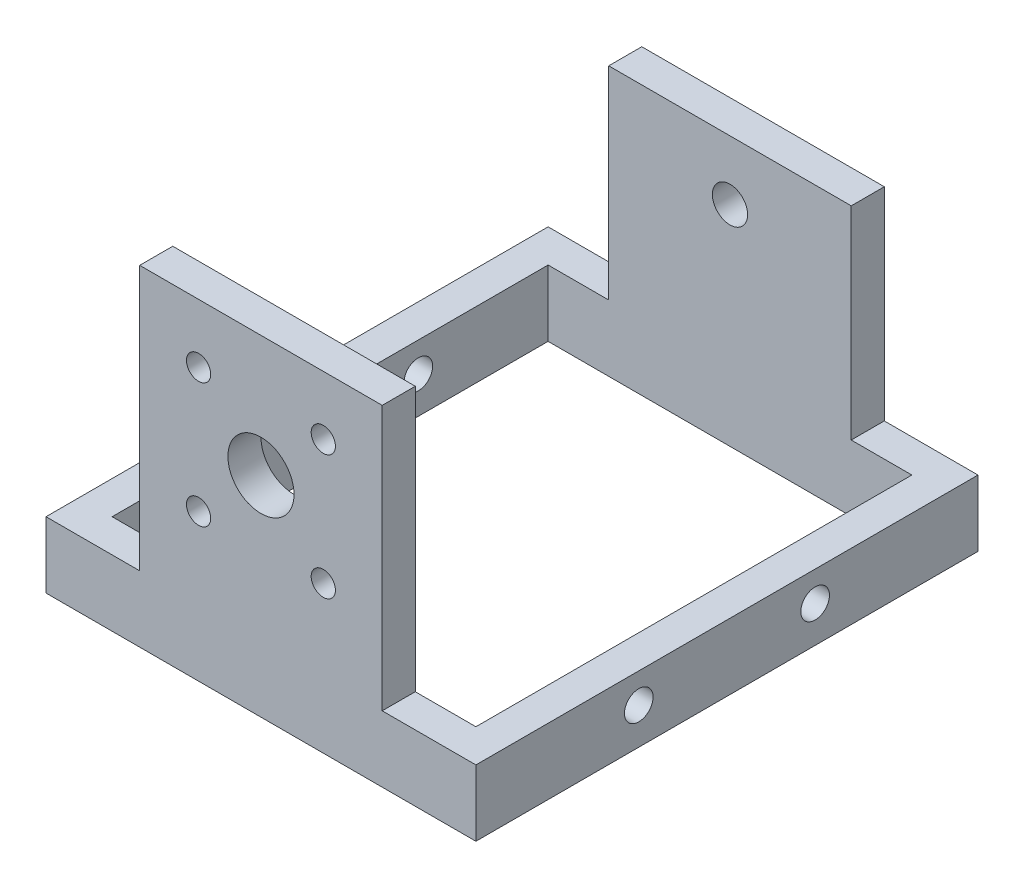
ISO-10303-21;
HEADER;
FILE_DESCRIPTION(('STEP AP214'),'2;1');
FILE_NAME('part.step','',(''),(''),'','','');
FILE_SCHEMA(('AUTOMOTIVE_DESIGN { 1 0 10303 214 1 1 1 1 }'));
ENDSEC;
DATA;
#1=APPLICATION_CONTEXT('core data for automotive mechanical design processes');
#2=APPLICATION_PROTOCOL_DEFINITION('international standard','automotive_design',2000,#1);
#3=PRODUCT_CONTEXT('',#1,'mechanical');
#4=PRODUCT('Part','Part','',(#3));
#5=PRODUCT_RELATED_PRODUCT_CATEGORY('part','',(#4));
#6=PRODUCT_DEFINITION_FORMATION('','',#4);
#7=PRODUCT_DEFINITION_CONTEXT('part definition',#1,'design');
#8=PRODUCT_DEFINITION('design','',#6,#7);
#9=PRODUCT_DEFINITION_SHAPE('','',#8);
#10=(LENGTH_UNIT() NAMED_UNIT(*) SI_UNIT(.MILLI.,.METRE.));
#11=(NAMED_UNIT(*) PLANE_ANGLE_UNIT() SI_UNIT($,.RADIAN.));
#12=(NAMED_UNIT(*) SI_UNIT($,.STERADIAN.) SOLID_ANGLE_UNIT());
#13=UNCERTAINTY_MEASURE_WITH_UNIT(LENGTH_MEASURE(1.E-05),#10,'distance_accuracy_value','');
#14=(GEOMETRIC_REPRESENTATION_CONTEXT(3) GLOBAL_UNCERTAINTY_ASSIGNED_CONTEXT((#13)) GLOBAL_UNIT_ASSIGNED_CONTEXT((#10,
#11,#12)) REPRESENTATION_CONTEXT('',''));
#15=CARTESIAN_POINT('',(0.,0.,0.));
#16=DIRECTION('',(0.,0.,1.));
#17=DIRECTION('',(1.,0.,0.));
#18=AXIS2_PLACEMENT_3D('',#15,#16,#17);
#19=CARTESIAN_POINT('',(0.,6.,-19.775));
#20=DIRECTION('',(0.,0.,1.));
#21=DIRECTION('',(1.,0.,0.));
#22=AXIS2_PLACEMENT_3D('',#19,#20,#21);
#23=PLANE('',#22);
#24=CARTESIAN_POINT('',(0.,19.,-19.775));
#25=DIRECTION('',(0.,0.,1.));
#26=DIRECTION('',(1.,0.,0.));
#27=AXIS2_PLACEMENT_3D('',#24,#25,#26);
#28=CIRCLE('',#27,1.6);
#29=CARTESIAN_POINT('',(1.6,19.,-19.775));
#30=VERTEX_POINT('',#29);
#31=EDGE_CURVE('E295',#30,#30,#28,.F.);
#32=ORIENTED_EDGE('',*,*,#31,.T.);
#33=EDGE_LOOP('',(#32));
#34=FACE_BOUND('',#33,.T.);
#35=DIRECTION('',(-1.,0.,0.));
#36=VECTOR('',#35,1.);
#37=CARTESIAN_POINT('',(0.,0.,-19.775));
#38=LINE('',#37,#36);
#39=CARTESIAN_POINT('',(16.5,0.,-19.775));
#40=VERTEX_POINT('',#39);
#41=CARTESIAN_POINT('',(-16.5,0.,-19.775));
#42=VERTEX_POINT('',#41);
#43=EDGE_CURVE('E237',#40,#42,#38,.T.);
#44=ORIENTED_EDGE('',*,*,#43,.F.);
#45=DIRECTION('',(0.,-1.,0.));
#46=VECTOR('',#45,1.);
#47=CARTESIAN_POINT('',(16.5,6.,-19.775));
#48=LINE('',#47,#46);
#49=CARTESIAN_POINT('',(16.5,6.,-19.775));
#50=VERTEX_POINT('',#49);
#51=EDGE_CURVE('E11',#50,#40,#48,.T.);
#52=ORIENTED_EDGE('',*,*,#51,.F.);
#53=DIRECTION('',(-1.,0.,0.));
#54=VECTOR('',#53,1.);
#55=CARTESIAN_POINT('',(0.,6.,-19.775));
#56=LINE('',#55,#54);
#57=CARTESIAN_POINT('',(11.,6.,-19.775));
#58=VERTEX_POINT('',#57);
#59=EDGE_CURVE('E240',#50,#58,#56,.T.);
#60=ORIENTED_EDGE('',*,*,#59,.T.);
#61=DIRECTION('',(0.,-1.,0.));
#62=VECTOR('',#61,1.);
#63=CARTESIAN_POINT('',(11.,24.4,-19.775));
#64=LINE('',#63,#62);
#65=CARTESIAN_POINT('',(11.,24.4,-19.775));
#66=VERTEX_POINT('',#65);
#67=EDGE_CURVE('E159',#66,#58,#64,.T.);
#68=ORIENTED_EDGE('',*,*,#67,.F.);
#69=DIRECTION('',(-1.,0.,0.));
#70=VECTOR('',#69,1.);
#71=CARTESIAN_POINT('',(0.,24.4,-19.775));
#72=LINE('',#71,#70);
#73=CARTESIAN_POINT('',(-11.,24.4,-19.775));
#74=VERTEX_POINT('',#73);
#75=EDGE_CURVE('E164',#66,#74,#72,.T.);
#76=ORIENTED_EDGE('',*,*,#75,.T.);
#77=DIRECTION('',(0.,-1.,0.));
#78=VECTOR('',#77,1.);
#79=CARTESIAN_POINT('',(-11.,24.4,-19.775));
#80=LINE('',#79,#78);
#81=CARTESIAN_POINT('',(-11.,6.,-19.775));
#82=VERTEX_POINT('',#81);
#83=EDGE_CURVE('E148',#74,#82,#80,.T.);
#84=ORIENTED_EDGE('',*,*,#83,.T.);
#85=DIRECTION('',(-1.,0.,0.));
#86=VECTOR('',#85,1.);
#87=CARTESIAN_POINT('',(0.,6.,-19.775));
#88=LINE('',#87,#86);
#89=CARTESIAN_POINT('',(-16.5,6.,-19.775));
#90=VERTEX_POINT('',#89);
#91=EDGE_CURVE('E185',#82,#90,#88,.T.);
#92=ORIENTED_EDGE('',*,*,#91,.T.);
#93=DIRECTION('',(0.,-1.,0.));
#94=VECTOR('',#93,1.);
#95=CARTESIAN_POINT('',(-16.5,6.,-19.775));
#96=LINE('',#95,#94);
#97=EDGE_CURVE('E202',#90,#42,#96,.T.);
#98=ORIENTED_EDGE('',*,*,#97,.T.);
#99=EDGE_LOOP('',(#44,#52,#60,#68,#76,#84,#92,#98));
#100=FACE_BOUND('',#99,.T.);
#101=ADVANCED_FACE('F34',(#34,#100),#23,.T.);
#102=CARTESIAN_POINT('',(16.5,6.,0.));
#103=DIRECTION('',(1.,0.,0.));
#104=DIRECTION('',(0.,0.,-1.));
#105=AXIS2_PLACEMENT_3D('',#102,#103,#104);
#106=PLANE('',#105);
#107=CARTESIAN_POINT('',(16.5,3.3,-8.));
#108=DIRECTION('',(1.,0.,0.));
#109=DIRECTION('',(0.,0.,-1.));
#110=AXIS2_PLACEMENT_3D('',#107,#108,#109);
#111=CIRCLE('',#110,1.3);
#112=CARTESIAN_POINT('',(16.5,3.3,-9.3));
#113=VERTEX_POINT('',#112);
#114=EDGE_CURVE('E168',#113,#113,#111,.T.);
#115=ORIENTED_EDGE('',*,*,#114,.T.);
#116=EDGE_LOOP('',(#115));
#117=FACE_BOUND('',#116,.T.);
#118=CARTESIAN_POINT('',(16.5,3.3,8.));
#119=DIRECTION('',(1.,0.,0.));
#120=DIRECTION('',(0.,0.,-1.));
#121=AXIS2_PLACEMENT_3D('',#118,#119,#120);
#122=CIRCLE('',#121,1.3);
#123=CARTESIAN_POINT('',(16.5,3.3,6.7));
#124=VERTEX_POINT('',#123);
#125=EDGE_CURVE('E276',#124,#124,#122,.T.);
#126=ORIENTED_EDGE('',*,*,#125,.T.);
#127=EDGE_LOOP('',(#126));
#128=FACE_BOUND('',#127,.T.);
#129=DIRECTION('',(0.,0.,1.));
#130=VECTOR('',#129,1.);
#131=CARTESIAN_POINT('',(16.5,0.,0.));
#132=LINE('',#131,#130);
#133=CARTESIAN_POINT('',(16.5,0.,19.775));
#134=VERTEX_POINT('',#133);
#135=EDGE_CURVE('E260',#40,#134,#132,.T.);
#136=ORIENTED_EDGE('',*,*,#135,.T.);
#137=DIRECTION('',(0.,-1.,0.));
#138=VECTOR('',#137,1.);
#139=CARTESIAN_POINT('',(16.5,6.,19.775));
#140=LINE('',#139,#138);
#141=CARTESIAN_POINT('',(16.5,6.,19.775));
#142=VERTEX_POINT('',#141);
#143=EDGE_CURVE('E42',#142,#134,#140,.T.);
#144=ORIENTED_EDGE('',*,*,#143,.F.);
#145=DIRECTION('',(0.,0.,1.));
#146=VECTOR('',#145,1.);
#147=CARTESIAN_POINT('',(16.5,6.,0.));
#148=LINE('',#147,#146);
#149=EDGE_CURVE('E243',#50,#142,#148,.T.);
#150=ORIENTED_EDGE('',*,*,#149,.F.);
#151=ORIENTED_EDGE('',*,*,#51,.T.);
#152=EDGE_LOOP('',(#136,#144,#150,#151));
#153=FACE_BOUND('',#152,.T.);
#154=ADVANCED_FACE('F328',(#117,#128,#153),#106,.F.);
#155=CARTESIAN_POINT('',(0.,6.,19.775));
#156=DIRECTION('',(0.,0.,1.));
#157=DIRECTION('',(1.,0.,0.));
#158=AXIS2_PLACEMENT_3D('',#155,#156,#157);
#159=PLANE('',#158);
#160=CARTESIAN_POINT('',(5.65685424949244,13.3431457505077,19.775));
#161=DIRECTION('',(0.,0.,1.));
#162=DIRECTION('',(1.,0.,0.));
#163=AXIS2_PLACEMENT_3D('',#160,#161,#162);
#164=CIRCLE('',#163,1.1);
#165=CARTESIAN_POINT('',(6.75685424949244,13.3431457505077,19.775));
#166=VERTEX_POINT('',#165);
#167=EDGE_CURVE('E398',#166,#166,#164,.F.);
#168=ORIENTED_EDGE('',*,*,#167,.F.);
#169=EDGE_LOOP('',(#168));
#170=FACE_BOUND('',#169,.T.);
#171=CARTESIAN_POINT('',(-5.65685424949241,24.6568542494924,19.775));
#172=DIRECTION('',(0.,0.,1.));
#173=DIRECTION('',(1.,0.,0.));
#174=AXIS2_PLACEMENT_3D('',#171,#172,#173);
#175=CIRCLE('',#174,1.1);
#176=CARTESIAN_POINT('',(-4.5568542494924,24.6568542494924,19.775));
#177=VERTEX_POINT('',#176);
#178=EDGE_CURVE('E393',#177,#177,#175,.F.);
#179=ORIENTED_EDGE('',*,*,#178,.F.);
#180=EDGE_LOOP('',(#179));
#181=FACE_BOUND('',#180,.T.);
#182=CARTESIAN_POINT('',(-5.65685424949238,13.3431457505076,19.775));
#183=DIRECTION('',(0.,0.,1.));
#184=DIRECTION('',(1.,0.,0.));
#185=AXIS2_PLACEMENT_3D('',#182,#183,#184);
#186=CIRCLE('',#185,1.1);
#187=CARTESIAN_POINT('',(-4.55685424949238,13.3431457505076,19.775));
#188=VERTEX_POINT('',#187);
#189=EDGE_CURVE('E410',#188,#188,#186,.F.);
#190=ORIENTED_EDGE('',*,*,#189,.F.);
#191=EDGE_LOOP('',(#190));
#192=FACE_BOUND('',#191,.T.);
#193=CARTESIAN_POINT('',(0.,19.,19.775));
#194=DIRECTION('',(0.,0.,1.));
#195=DIRECTION('',(1.,0.,0.));
#196=AXIS2_PLACEMENT_3D('',#193,#194,#195);
#197=CIRCLE('',#196,3.);
#198=CARTESIAN_POINT('',(3.,19.,19.775));
#199=VERTEX_POINT('',#198);
#200=EDGE_CURVE('E383',#199,#199,#197,.F.);
#201=ORIENTED_EDGE('',*,*,#200,.F.);
#202=EDGE_LOOP('',(#201));
#203=FACE_BOUND('',#202,.T.);
#204=CARTESIAN_POINT('',(5.65685424949238,24.6568542494924,19.775));
#205=DIRECTION('',(0.,0.,1.));
#206=DIRECTION('',(1.,0.,0.));
#207=AXIS2_PLACEMENT_3D('',#204,#205,#206);
#208=CIRCLE('',#207,1.1);
#209=CARTESIAN_POINT('',(6.75685424949238,24.6568542494924,19.775));
#210=VERTEX_POINT('',#209);
#211=EDGE_CURVE('E386',#210,#210,#208,.F.);
#212=ORIENTED_EDGE('',*,*,#211,.F.);
#213=EDGE_LOOP('',(#212));
#214=FACE_BOUND('',#213,.T.);
#215=DIRECTION('',(-1.,0.,0.));
#216=VECTOR('',#215,1.);
#217=CARTESIAN_POINT('',(0.,0.,19.775));
#218=LINE('',#217,#216);
#219=CARTESIAN_POINT('',(-16.5,0.,19.775));
#220=VERTEX_POINT('',#219);
#221=EDGE_CURVE('E262',#134,#220,#218,.T.);
#222=ORIENTED_EDGE('',*,*,#221,.T.);
#223=DIRECTION('',(0.,-1.,0.));
#224=VECTOR('',#223,1.);
#225=CARTESIAN_POINT('',(-16.5,6.,19.775));
#226=LINE('',#225,#224);
#227=CARTESIAN_POINT('',(-16.5,6.,19.775));
#228=VERTEX_POINT('',#227);
#229=EDGE_CURVE('E209',#228,#220,#226,.T.);
#230=ORIENTED_EDGE('',*,*,#229,.F.);
#231=DIRECTION('',(-1.,0.,0.));
#232=VECTOR('',#231,1.);
#233=CARTESIAN_POINT('',(0.,6.,19.775));
#234=LINE('',#233,#232);
#235=CARTESIAN_POINT('',(-11.,6.,19.775));
#236=VERTEX_POINT('',#235);
#237=EDGE_CURVE('E197',#236,#228,#234,.T.);
#238=ORIENTED_EDGE('',*,*,#237,.F.);
#239=DIRECTION('',(0.,-1.,0.));
#240=VECTOR('',#239,1.);
#241=CARTESIAN_POINT('',(-11.,30.,19.775));
#242=LINE('',#241,#240);
#243=CARTESIAN_POINT('',(-11.,30.,19.775));
#244=VERTEX_POINT('',#243);
#245=EDGE_CURVE('E50',#244,#236,#242,.T.);
#246=ORIENTED_EDGE('',*,*,#245,.F.);
#247=DIRECTION('',(-1.,0.,0.));
#248=VECTOR('',#247,1.);
#249=CARTESIAN_POINT('',(0.,30.,19.775));
#250=LINE('',#249,#248);
#251=CARTESIAN_POINT('',(11.,30.,19.775));
#252=VERTEX_POINT('',#251);
#253=EDGE_CURVE('E221',#252,#244,#250,.T.);
#254=ORIENTED_EDGE('',*,*,#253,.F.);
#255=DIRECTION('',(0.,-1.,0.));
#256=VECTOR('',#255,1.);
#257=CARTESIAN_POINT('',(11.,30.,19.775));
#258=LINE('',#257,#256);
#259=CARTESIAN_POINT('',(11.,6.,19.775));
#260=VERTEX_POINT('',#259);
#261=EDGE_CURVE('E234',#252,#260,#258,.T.);
#262=ORIENTED_EDGE('',*,*,#261,.T.);
#263=DIRECTION('',(-1.,0.,0.));
#264=VECTOR('',#263,1.);
#265=CARTESIAN_POINT('',(0.,6.,19.775));
#266=LINE('',#265,#264);
#267=EDGE_CURVE('E245',#142,#260,#266,.T.);
#268=ORIENTED_EDGE('',*,*,#267,.F.);
#269=ORIENTED_EDGE('',*,*,#143,.T.);
#270=EDGE_LOOP('',(#222,#230,#238,#246,#254,#262,#268,#269));
#271=FACE_BOUND('',#270,.T.);
#272=ADVANCED_FACE('F323',(#170,#181,#192,#203,#214,#271),#159,.F.);
#273=CARTESIAN_POINT('',(0.,6.,22.775));
#274=DIRECTION('',(0.,0.,1.));
#275=DIRECTION('',(1.,0.,0.));
#276=AXIS2_PLACEMENT_3D('',#273,#274,#275);
#277=PLANE('',#276);
#278=CARTESIAN_POINT('',(5.65685424949244,13.3431457505077,22.775));
#279=DIRECTION('',(0.,0.,1.));
#280=DIRECTION('',(0.,-1.,0.));
#281=AXIS2_PLACEMENT_3D('',#278,#279,#280);
#282=CIRCLE('',#281,1.1);
#283=CARTESIAN_POINT('',(5.65685424949245,12.2431457505077,22.775));
#284=VERTEX_POINT('',#283);
#285=EDGE_CURVE('E402',#284,#284,#282,.T.);
#286=ORIENTED_EDGE('',*,*,#285,.F.);
#287=EDGE_LOOP('',(#286));
#288=FACE_BOUND('',#287,.T.);
#289=CARTESIAN_POINT('',(-5.65685424949241,24.6568542494924,22.775));
#290=DIRECTION('',(0.,0.,1.));
#291=DIRECTION('',(0.,1.,0.));
#292=AXIS2_PLACEMENT_3D('',#289,#290,#291);
#293=CIRCLE('',#292,1.1);
#294=CARTESIAN_POINT('',(-5.65685424949241,25.7568542494924,22.775));
#295=VERTEX_POINT('',#294);
#296=EDGE_CURVE('E407',#295,#295,#293,.T.);
#297=ORIENTED_EDGE('',*,*,#296,.F.);
#298=EDGE_LOOP('',(#297));
#299=FACE_BOUND('',#298,.T.);
#300=CARTESIAN_POINT('',(-5.65685424949238,13.3431457505076,22.775));
#301=DIRECTION('',(0.,0.,1.));
#302=DIRECTION('',(-1.,0.,0.));
#303=AXIS2_PLACEMENT_3D('',#300,#301,#302);
#304=CIRCLE('',#303,1.1);
#305=CARTESIAN_POINT('',(-6.75685424949238,13.3431457505076,22.775));
#306=VERTEX_POINT('',#305);
#307=EDGE_CURVE('E401',#306,#306,#304,.T.);
#308=ORIENTED_EDGE('',*,*,#307,.F.);
#309=EDGE_LOOP('',(#308));
#310=FACE_BOUND('',#309,.T.);
#311=CARTESIAN_POINT('',(0.,19.,22.775));
#312=DIRECTION('',(0.,0.,1.));
#313=DIRECTION('',(1.,0.,0.));
#314=AXIS2_PLACEMENT_3D('',#311,#312,#313);
#315=CIRCLE('',#314,3.);
#316=CARTESIAN_POINT('',(3.,19.,22.775));
#317=VERTEX_POINT('',#316);
#318=EDGE_CURVE('E389',#317,#317,#315,.T.);
#319=ORIENTED_EDGE('',*,*,#318,.F.);
#320=EDGE_LOOP('',(#319));
#321=FACE_BOUND('',#320,.T.);
#322=CARTESIAN_POINT('',(5.65685424949238,24.6568542494924,22.775));
#323=DIRECTION('',(0.,0.,1.));
#324=DIRECTION('',(1.,0.,0.));
#325=AXIS2_PLACEMENT_3D('',#322,#323,#324);
#326=CIRCLE('',#325,1.1);
#327=CARTESIAN_POINT('',(6.75685424949238,24.6568542494924,22.775));
#328=VERTEX_POINT('',#327);
#329=EDGE_CURVE('E390',#328,#328,#326,.T.);
#330=ORIENTED_EDGE('',*,*,#329,.F.);
#331=EDGE_LOOP('',(#330));
#332=FACE_BOUND('',#331,.T.);
#333=DIRECTION('',(-1.,0.,0.));
#334=VECTOR('',#333,1.);
#335=CARTESIAN_POINT('',(0.,0.,22.775));
#336=LINE('',#335,#334);
#337=CARTESIAN_POINT('',(19.5,0.,22.775));
#338=VERTEX_POINT('',#337);
#339=CARTESIAN_POINT('',(-19.5,0.,22.775));
#340=VERTEX_POINT('',#339);
#341=EDGE_CURVE('E264',#338,#340,#336,.T.);
#342=ORIENTED_EDGE('',*,*,#341,.F.);
#343=DIRECTION('',(0.,-1.,0.));
#344=VECTOR('',#343,1.);
#345=CARTESIAN_POINT('',(19.5,6.,22.775));
#346=LINE('',#345,#344);
#347=CARTESIAN_POINT('',(19.5,6.,22.775));
#348=VERTEX_POINT('',#347);
#349=EDGE_CURVE('E271',#348,#338,#346,.T.);
#350=ORIENTED_EDGE('',*,*,#349,.F.);
#351=DIRECTION('',(-1.,0.,0.));
#352=VECTOR('',#351,1.);
#353=CARTESIAN_POINT('',(0.,6.,22.775));
#354=LINE('',#353,#352);
#355=CARTESIAN_POINT('',(11.,6.,22.775));
#356=VERTEX_POINT('',#355);
#357=EDGE_CURVE('E249',#348,#356,#354,.T.);
#358=ORIENTED_EDGE('',*,*,#357,.T.);
#359=DIRECTION('',(0.,-1.,0.));
#360=VECTOR('',#359,1.);
#361=CARTESIAN_POINT('',(11.,30.,22.775));
#362=LINE('',#361,#360);
#363=CARTESIAN_POINT('',(11.,30.,22.775));
#364=VERTEX_POINT('',#363);
#365=EDGE_CURVE('E228',#364,#356,#362,.T.);
#366=ORIENTED_EDGE('',*,*,#365,.F.);
#367=DIRECTION('',(-1.,0.,0.));
#368=VECTOR('',#367,1.);
#369=CARTESIAN_POINT('',(0.,30.,22.775));
#370=LINE('',#369,#368);
#371=CARTESIAN_POINT('',(-11.,30.,22.775));
#372=VERTEX_POINT('',#371);
#373=EDGE_CURVE('E225',#364,#372,#370,.T.);
#374=ORIENTED_EDGE('',*,*,#373,.T.);
#375=DIRECTION('',(0.,-1.,0.));
#376=VECTOR('',#375,1.);
#377=CARTESIAN_POINT('',(-11.,30.,22.775));
#378=LINE('',#377,#376);
#379=CARTESIAN_POINT('',(-11.,6.,22.775));
#380=VERTEX_POINT('',#379);
#381=EDGE_CURVE('E231',#372,#380,#378,.T.);
#382=ORIENTED_EDGE('',*,*,#381,.T.);
#383=DIRECTION('',(-1.,0.,0.));
#384=VECTOR('',#383,1.);
#385=CARTESIAN_POINT('',(0.,6.,22.775));
#386=LINE('',#385,#384);
#387=CARTESIAN_POINT('',(-19.5,6.,22.775));
#388=VERTEX_POINT('',#387);
#389=EDGE_CURVE('E193',#380,#388,#386,.T.);
#390=ORIENTED_EDGE('',*,*,#389,.T.);
#391=DIRECTION('',(0.,-1.,0.));
#392=VECTOR('',#391,1.);
#393=CARTESIAN_POINT('',(-19.5,6.,22.775));
#394=LINE('',#393,#392);
#395=EDGE_CURVE('E212',#388,#340,#394,.T.);
#396=ORIENTED_EDGE('',*,*,#395,.T.);
#397=EDGE_LOOP('',(#342,#350,#358,#366,#374,#382,#390,#396));
#398=FACE_BOUND('',#397,.T.);
#399=ADVANCED_FACE('F349',(#288,#299,#310,#321,#332,#398),#277,.T.);
#400=CARTESIAN_POINT('',(19.5,6.,0.));
#401=DIRECTION('',(1.,0.,0.));
#402=DIRECTION('',(0.,0.,-1.));
#403=AXIS2_PLACEMENT_3D('',#400,#401,#402);
#404=PLANE('',#403);
#405=CARTESIAN_POINT('',(19.5,3.3,-8.));
#406=DIRECTION('',(1.,0.,0.));
#407=DIRECTION('',(0.,0.,-1.));
#408=AXIS2_PLACEMENT_3D('',#405,#406,#407);
#409=CIRCLE('',#408,1.3);
#410=CARTESIAN_POINT('',(19.5,3.3,-9.3));
#411=VERTEX_POINT('',#410);
#412=EDGE_CURVE('E277',#411,#411,#409,.F.);
#413=ORIENTED_EDGE('',*,*,#412,.T.);
#414=EDGE_LOOP('',(#413));
#415=FACE_BOUND('',#414,.T.);
#416=CARTESIAN_POINT('',(19.5,3.3,8.));
#417=DIRECTION('',(1.,0.,0.));
#418=DIRECTION('',(0.,0.,-1.));
#419=AXIS2_PLACEMENT_3D('',#416,#417,#418);
#420=CIRCLE('',#419,1.3);
#421=CARTESIAN_POINT('',(19.5,3.3,6.7));
#422=VERTEX_POINT('',#421);
#423=EDGE_CURVE('E288',#422,#422,#420,.F.);
#424=ORIENTED_EDGE('',*,*,#423,.T.);
#425=EDGE_LOOP('',(#424));
#426=FACE_BOUND('',#425,.T.);
#427=DIRECTION('',(0.,0.,1.));
#428=VECTOR('',#427,1.);
#429=CARTESIAN_POINT('',(19.5,0.,0.));
#430=LINE('',#429,#428);
#431=CARTESIAN_POINT('',(19.5,0.,-22.775));
#432=VERTEX_POINT('',#431);
#433=EDGE_CURVE('E266',#432,#338,#430,.T.);
#434=ORIENTED_EDGE('',*,*,#433,.F.);
#435=DIRECTION('',(0.,-1.,0.));
#436=VECTOR('',#435,1.);
#437=CARTESIAN_POINT('',(19.5,6.,-22.775));
#438=LINE('',#437,#436);
#439=CARTESIAN_POINT('',(19.5,6.,-22.775));
#440=VERTEX_POINT('',#439);
#441=EDGE_CURVE('E258',#440,#432,#438,.T.);
#442=ORIENTED_EDGE('',*,*,#441,.F.);
#443=DIRECTION('',(0.,0.,1.));
#444=VECTOR('',#443,1.);
#445=CARTESIAN_POINT('',(19.5,6.,0.));
#446=LINE('',#445,#444);
#447=EDGE_CURVE('E252',#440,#348,#446,.T.);
#448=ORIENTED_EDGE('',*,*,#447,.T.);
#449=ORIENTED_EDGE('',*,*,#349,.T.);
#450=EDGE_LOOP('',(#434,#442,#448,#449));
#451=FACE_BOUND('',#450,.T.);
#452=ADVANCED_FACE('F362',(#415,#426,#451),#404,.T.);
#453=CARTESIAN_POINT('',(0.,6.,-22.775));
#454=DIRECTION('',(0.,0.,1.));
#455=DIRECTION('',(1.,0.,0.));
#456=AXIS2_PLACEMENT_3D('',#453,#454,#455);
#457=PLANE('',#456);
#458=CARTESIAN_POINT('',(0.,19.,-22.775));
#459=DIRECTION('',(0.,0.,-1.));
#460=DIRECTION('',(-1.,0.,0.));
#461=AXIS2_PLACEMENT_3D('',#458,#459,#460);
#462=CIRCLE('',#461,1.6);
#463=CARTESIAN_POINT('',(-1.6,19.,-22.775));
#464=VERTEX_POINT('',#463);
#465=EDGE_CURVE('E381',#464,#464,#462,.T.);
#466=ORIENTED_EDGE('',*,*,#465,.F.);
#467=EDGE_LOOP('',(#466));
#468=FACE_BOUND('',#467,.T.);
#469=DIRECTION('',(-1.,0.,0.));
#470=VECTOR('',#469,1.);
#471=CARTESIAN_POINT('',(0.,0.,-22.775));
#472=LINE('',#471,#470);
#473=CARTESIAN_POINT('',(-19.5,0.,-22.775));
#474=VERTEX_POINT('',#473);
#475=EDGE_CURVE('E241',#432,#474,#472,.T.);
#476=ORIENTED_EDGE('',*,*,#475,.T.);
#477=DIRECTION('',(0.,-1.,0.));
#478=VECTOR('',#477,1.);
#479=CARTESIAN_POINT('',(-19.5,6.,-22.775));
#480=LINE('',#479,#478);
#481=CARTESIAN_POINT('',(-19.5,6.,-22.775));
#482=VERTEX_POINT('',#481);
#483=EDGE_CURVE('E215',#482,#474,#480,.T.);
#484=ORIENTED_EDGE('',*,*,#483,.F.);
#485=DIRECTION('',(-1.,0.,0.));
#486=VECTOR('',#485,1.);
#487=CARTESIAN_POINT('',(0.,6.,-22.775));
#488=LINE('',#487,#486);
#489=CARTESIAN_POINT('',(-11.,6.,-22.775));
#490=VERTEX_POINT('',#489);
#491=EDGE_CURVE('E189',#490,#482,#488,.T.);
#492=ORIENTED_EDGE('',*,*,#491,.F.);
#493=DIRECTION('',(0.,-1.,0.));
#494=VECTOR('',#493,1.);
#495=CARTESIAN_POINT('',(-11.,24.4,-22.775));
#496=LINE('',#495,#494);
#497=CARTESIAN_POINT('',(-11.,24.4,-22.775));
#498=VERTEX_POINT('',#497);
#499=EDGE_CURVE('E179',#498,#490,#496,.T.);
#500=ORIENTED_EDGE('',*,*,#499,.F.);
#501=DIRECTION('',(-1.,0.,0.));
#502=VECTOR('',#501,1.);
#503=CARTESIAN_POINT('',(0.,24.4,-22.775));
#504=LINE('',#503,#502);
#505=CARTESIAN_POINT('',(11.,24.4,-22.775));
#506=VERTEX_POINT('',#505);
#507=EDGE_CURVE('E166',#506,#498,#504,.T.);
#508=ORIENTED_EDGE('',*,*,#507,.F.);
#509=DIRECTION('',(0.,-1.,0.));
#510=VECTOR('',#509,1.);
#511=CARTESIAN_POINT('',(11.,24.4,-22.775));
#512=LINE('',#511,#510);
#513=CARTESIAN_POINT('',(11.,6.,-22.775));
#514=VERTEX_POINT('',#513);
#515=EDGE_CURVE('E181',#506,#514,#512,.T.);
#516=ORIENTED_EDGE('',*,*,#515,.T.);
#517=DIRECTION('',(-1.,0.,0.));
#518=VECTOR('',#517,1.);
#519=CARTESIAN_POINT('',(0.,6.,-22.775));
#520=LINE('',#519,#518);
#521=EDGE_CURVE('E255',#440,#514,#520,.T.);
#522=ORIENTED_EDGE('',*,*,#521,.F.);
#523=ORIENTED_EDGE('',*,*,#441,.T.);
#524=EDGE_LOOP('',(#476,#484,#492,#500,#508,#516,#522,#523));
#525=FACE_BOUND('',#524,.T.);
#526=ADVANCED_FACE('F339',(#468,#525),#457,.F.);
#527=CARTESIAN_POINT('',(0.,6.,0.));
#528=DIRECTION('',(0.,1.,0.));
#529=DIRECTION('',(0.,0.,1.));
#530=AXIS2_PLACEMENT_3D('',#527,#528,#529);
#531=PLANE('',#530);
#532=DIRECTION('',(0.,0.,-1.));
#533=VECTOR('',#532,1.);
#534=CARTESIAN_POINT('',(11.,6.,0.));
#535=LINE('',#534,#533);
#536=EDGE_CURVE('E238',#58,#514,#535,.T.);
#537=ORIENTED_EDGE('',*,*,#536,.F.);
#538=ORIENTED_EDGE('',*,*,#59,.F.);
#539=ORIENTED_EDGE('',*,*,#149,.T.);
#540=ORIENTED_EDGE('',*,*,#267,.T.);
#541=DIRECTION('',(0.,0.,1.));
#542=VECTOR('',#541,1.);
#543=CARTESIAN_POINT('',(11.,6.,0.));
#544=LINE('',#543,#542);
#545=EDGE_CURVE('E247',#260,#356,#544,.T.);
#546=ORIENTED_EDGE('',*,*,#545,.T.);
#547=ORIENTED_EDGE('',*,*,#357,.F.);
#548=ORIENTED_EDGE('',*,*,#447,.F.);
#549=ORIENTED_EDGE('',*,*,#521,.T.);
#550=EDGE_LOOP('',(#537,#538,#539,#540,#546,#547,#548,#549));
#551=FACE_BOUND('',#550,.T.);
#552=ADVANCED_FACE('F332',(#551),#531,.T.);
#553=CARTESIAN_POINT('',(0.,0.,0.));
#554=DIRECTION('',(0.,1.,0.));
#555=DIRECTION('',(0.,0.,1.));
#556=AXIS2_PLACEMENT_3D('',#553,#554,#555);
#557=PLANE('',#556);
#558=DIRECTION('',(0.,0.,1.));
#559=VECTOR('',#558,1.);
#560=CARTESIAN_POINT('',(-19.5,0.,0.));
#561=LINE('',#560,#559);
#562=EDGE_CURVE('E158',#474,#340,#561,.T.);
#563=ORIENTED_EDGE('',*,*,#562,.F.);
#564=ORIENTED_EDGE('',*,*,#475,.F.);
#565=ORIENTED_EDGE('',*,*,#433,.T.);
#566=ORIENTED_EDGE('',*,*,#341,.T.);
#567=EDGE_LOOP('',(#563,#564,#565,#566));
#568=FACE_BOUND('',#567,.T.);
#569=ORIENTED_EDGE('',*,*,#43,.T.);
#570=DIRECTION('',(0.,0.,1.));
#571=VECTOR('',#570,1.);
#572=CARTESIAN_POINT('',(-16.5,0.,0.));
#573=LINE('',#572,#571);
#574=EDGE_CURVE('E187',#42,#220,#573,.T.);
#575=ORIENTED_EDGE('',*,*,#574,.T.);
#576=ORIENTED_EDGE('',*,*,#221,.F.);
#577=ORIENTED_EDGE('',*,*,#135,.F.);
#578=EDGE_LOOP('',(#569,#575,#576,#577));
#579=FACE_BOUND('',#578,.T.);
#580=ADVANCED_FACE('F317',(#568,#579),#557,.F.);
#581=CARTESIAN_POINT('',(11.,30.,0.));
#582=DIRECTION('',(1.,0.,0.));
#583=DIRECTION('',(0.,0.,-1.));
#584=AXIS2_PLACEMENT_3D('',#581,#582,#583);
#585=PLANE('',#584);
#586=ORIENTED_EDGE('',*,*,#365,.T.);
#587=ORIENTED_EDGE('',*,*,#545,.F.);
#588=ORIENTED_EDGE('',*,*,#261,.F.);
#589=DIRECTION('',(0.,0.,1.));
#590=VECTOR('',#589,1.);
#591=CARTESIAN_POINT('',(11.,30.,0.));
#592=LINE('',#591,#590);
#593=EDGE_CURVE('E218',#252,#364,#592,.T.);
#594=ORIENTED_EDGE('',*,*,#593,.T.);
#595=EDGE_LOOP('',(#586,#587,#588,#594));
#596=FACE_BOUND('',#595,.T.);
#597=ADVANCED_FACE('F358',(#596),#585,.T.);
#598=CARTESIAN_POINT('',(-11.,30.,0.));
#599=DIRECTION('',(1.,0.,0.));
#600=DIRECTION('',(0.,0.,-1.));
#601=AXIS2_PLACEMENT_3D('',#598,#599,#600);
#602=PLANE('',#601);
#603=ORIENTED_EDGE('',*,*,#245,.T.);
#604=DIRECTION('',(0.,0.,1.));
#605=VECTOR('',#604,1.);
#606=CARTESIAN_POINT('',(-11.,6.,0.));
#607=LINE('',#606,#605);
#608=EDGE_CURVE('E55',#236,#380,#607,.T.);
#609=ORIENTED_EDGE('',*,*,#608,.T.);
#610=ORIENTED_EDGE('',*,*,#381,.F.);
#611=DIRECTION('',(0.,0.,1.));
#612=VECTOR('',#611,1.);
#613=CARTESIAN_POINT('',(-11.,30.,0.));
#614=LINE('',#613,#612);
#615=EDGE_CURVE('E223',#244,#372,#614,.T.);
#616=ORIENTED_EDGE('',*,*,#615,.F.);
#617=EDGE_LOOP('',(#603,#609,#610,#616));
#618=FACE_BOUND('',#617,.T.);
#619=ADVANCED_FACE('F351',(#618),#602,.F.);
#620=CARTESIAN_POINT('',(0.,30.,0.));
#621=DIRECTION('',(0.,1.,0.));
#622=DIRECTION('',(0.,0.,1.));
#623=AXIS2_PLACEMENT_3D('',#620,#621,#622);
#624=PLANE('',#623);
#625=ORIENTED_EDGE('',*,*,#593,.F.);
#626=ORIENTED_EDGE('',*,*,#253,.T.);
#627=ORIENTED_EDGE('',*,*,#615,.T.);
#628=ORIENTED_EDGE('',*,*,#373,.F.);
#629=EDGE_LOOP('',(#625,#626,#627,#628));
#630=FACE_BOUND('',#629,.T.);
#631=ADVANCED_FACE('F354',(#630),#624,.T.);
#632=CARTESIAN_POINT('',(-19.5,6.,0.));
#633=DIRECTION('',(1.,0.,0.));
#634=DIRECTION('',(0.,0.,-1.));
#635=AXIS2_PLACEMENT_3D('',#632,#633,#634);
#636=PLANE('',#635);
#637=CARTESIAN_POINT('',(-19.5,3.3,-8.));
#638=DIRECTION('',(-1.,0.,0.));
#639=DIRECTION('',(0.,0.,1.));
#640=AXIS2_PLACEMENT_3D('',#637,#638,#639);
#641=CIRCLE('',#640,1.3);
#642=CARTESIAN_POINT('',(-19.5,3.3,-6.7));
#643=VERTEX_POINT('',#642);
#644=EDGE_CURVE('E283',#643,#643,#641,.T.);
#645=ORIENTED_EDGE('',*,*,#644,.F.);
#646=EDGE_LOOP('',(#645));
#647=FACE_BOUND('',#646,.T.);
#648=CARTESIAN_POINT('',(-19.5,3.3,8.));
#649=DIRECTION('',(-1.,0.,0.));
#650=DIRECTION('',(0.,0.,-1.));
#651=AXIS2_PLACEMENT_3D('',#648,#649,#650);
#652=CIRCLE('',#651,1.3);
#653=CARTESIAN_POINT('',(-19.5,3.3,6.7));
#654=VERTEX_POINT('',#653);
#655=EDGE_CURVE('E292',#654,#654,#652,.T.);
#656=ORIENTED_EDGE('',*,*,#655,.F.);
#657=EDGE_LOOP('',(#656));
#658=FACE_BOUND('',#657,.T.);
#659=ORIENTED_EDGE('',*,*,#562,.T.);
#660=ORIENTED_EDGE('',*,*,#395,.F.);
#661=DIRECTION('',(0.,0.,1.));
#662=VECTOR('',#661,1.);
#663=CARTESIAN_POINT('',(-19.5,6.,0.));
#664=LINE('',#663,#662);
#665=EDGE_CURVE('E191',#482,#388,#664,.T.);
#666=ORIENTED_EDGE('',*,*,#665,.F.);
#667=ORIENTED_EDGE('',*,*,#483,.T.);
#668=EDGE_LOOP('',(#659,#660,#666,#667));
#669=FACE_BOUND('',#668,.T.);
#670=ADVANCED_FACE('F310',(#647,#658,#669),#636,.F.);
#671=CARTESIAN_POINT('',(-16.5,6.,0.));
#672=DIRECTION('',(1.,0.,0.));
#673=DIRECTION('',(0.,0.,-1.));
#674=AXIS2_PLACEMENT_3D('',#671,#672,#673);
#675=PLANE('',#674);
#676=CARTESIAN_POINT('',(-16.5,3.3,-8.));
#677=DIRECTION('',(1.,0.,0.));
#678=DIRECTION('',(0.,0.,-1.));
#679=AXIS2_PLACEMENT_3D('',#676,#677,#678);
#680=CIRCLE('',#679,1.3);
#681=CARTESIAN_POINT('',(-16.5,3.3,-9.3));
#682=VERTEX_POINT('',#681);
#683=EDGE_CURVE('E37',#682,#682,#680,.T.);
#684=ORIENTED_EDGE('',*,*,#683,.F.);
#685=EDGE_LOOP('',(#684));
#686=FACE_BOUND('',#685,.T.);
#687=CARTESIAN_POINT('',(-16.5,3.3,8.));
#688=DIRECTION('',(1.,0.,0.));
#689=DIRECTION('',(0.,0.,-1.));
#690=AXIS2_PLACEMENT_3D('',#687,#688,#689);
#691=CIRCLE('',#690,1.3);
#692=CARTESIAN_POINT('',(-16.5,3.3,6.7));
#693=VERTEX_POINT('',#692);
#694=EDGE_CURVE('E274',#693,#693,#691,.T.);
#695=ORIENTED_EDGE('',*,*,#694,.F.);
#696=EDGE_LOOP('',(#695));
#697=FACE_BOUND('',#696,.T.);
#698=ORIENTED_EDGE('',*,*,#574,.F.);
#699=ORIENTED_EDGE('',*,*,#97,.F.);
#700=DIRECTION('',(0.,0.,1.));
#701=VECTOR('',#700,1.);
#702=CARTESIAN_POINT('',(-16.5,6.,0.));
#703=LINE('',#702,#701);
#704=EDGE_CURVE('E199',#90,#228,#703,.T.);
#705=ORIENTED_EDGE('',*,*,#704,.T.);
#706=ORIENTED_EDGE('',*,*,#229,.T.);
#707=EDGE_LOOP('',(#698,#699,#705,#706));
#708=FACE_BOUND('',#707,.T.);
#709=ADVANCED_FACE('F306',(#686,#697,#708),#675,.T.);
#710=CARTESIAN_POINT('',(0.,6.,0.));
#711=DIRECTION('',(0.,1.,0.));
#712=DIRECTION('',(0.,0.,1.));
#713=AXIS2_PLACEMENT_3D('',#710,#711,#712);
#714=PLANE('',#713);
#715=ORIENTED_EDGE('',*,*,#91,.F.);
#716=DIRECTION('',(0.,0.,-1.));
#717=VECTOR('',#716,1.);
#718=CARTESIAN_POINT('',(-11.,6.,0.));
#719=LINE('',#718,#717);
#720=EDGE_CURVE('E153',#82,#490,#719,.T.);
#721=ORIENTED_EDGE('',*,*,#720,.T.);
#722=ORIENTED_EDGE('',*,*,#491,.T.);
#723=ORIENTED_EDGE('',*,*,#665,.T.);
#724=ORIENTED_EDGE('',*,*,#389,.F.);
#725=ORIENTED_EDGE('',*,*,#608,.F.);
#726=ORIENTED_EDGE('',*,*,#237,.T.);
#727=ORIENTED_EDGE('',*,*,#704,.F.);
#728=EDGE_LOOP('',(#715,#721,#722,#723,#724,#725,#726,#727));
#729=FACE_BOUND('',#728,.T.);
#730=ADVANCED_FACE('F309',(#729),#714,.T.);
#731=CARTESIAN_POINT('',(-11.,24.4,0.));
#732=DIRECTION('',(-1.,0.,0.));
#733=DIRECTION('',(0.,0.,1.));
#734=AXIS2_PLACEMENT_3D('',#731,#732,#733);
#735=PLANE('',#734);
#736=ORIENTED_EDGE('',*,*,#499,.T.);
#737=ORIENTED_EDGE('',*,*,#720,.F.);
#738=ORIENTED_EDGE('',*,*,#83,.F.);
#739=DIRECTION('',(0.,0.,-1.));
#740=VECTOR('',#739,1.);
#741=CARTESIAN_POINT('',(-11.,24.4,0.));
#742=LINE('',#741,#740);
#743=EDGE_CURVE('E151',#74,#498,#742,.T.);
#744=ORIENTED_EDGE('',*,*,#743,.T.);
#745=EDGE_LOOP('',(#736,#737,#738,#744));
#746=FACE_BOUND('',#745,.T.);
#747=ADVANCED_FACE('F150',(#746),#735,.T.);
#748=CARTESIAN_POINT('',(11.,24.4,0.));
#749=DIRECTION('',(-1.,0.,0.));
#750=DIRECTION('',(0.,0.,1.));
#751=AXIS2_PLACEMENT_3D('',#748,#749,#750);
#752=PLANE('',#751);
#753=ORIENTED_EDGE('',*,*,#536,.T.);
#754=ORIENTED_EDGE('',*,*,#515,.F.);
#755=DIRECTION('',(0.,0.,-1.));
#756=VECTOR('',#755,1.);
#757=CARTESIAN_POINT('',(11.,24.4,0.));
#758=LINE('',#757,#756);
#759=EDGE_CURVE('E173',#66,#506,#758,.T.);
#760=ORIENTED_EDGE('',*,*,#759,.F.);
#761=ORIENTED_EDGE('',*,*,#67,.T.);
#762=EDGE_LOOP('',(#753,#754,#760,#761));
#763=FACE_BOUND('',#762,.T.);
#764=ADVANCED_FACE('F337',(#763),#752,.F.);
#765=CARTESIAN_POINT('',(0.,24.4,0.));
#766=DIRECTION('',(0.,1.,0.));
#767=DIRECTION('',(0.,0.,1.));
#768=AXIS2_PLACEMENT_3D('',#765,#766,#767);
#769=PLANE('',#768);
#770=ORIENTED_EDGE('',*,*,#743,.F.);
#771=ORIENTED_EDGE('',*,*,#75,.F.);
#772=ORIENTED_EDGE('',*,*,#759,.T.);
#773=ORIENTED_EDGE('',*,*,#507,.T.);
#774=EDGE_LOOP('',(#770,#771,#772,#773));
#775=FACE_BOUND('',#774,.T.);
#776=ADVANCED_FACE('F163',(#775),#769,.T.);
#777=CARTESIAN_POINT('',(23.17695526217,3.3,8.));
#778=DIRECTION('',(-1.,0.,0.));
#779=DIRECTION('',(0.,0.,1.));
#780=AXIS2_PLACEMENT_3D('',#777,#778,#779);
#781=CYLINDRICAL_SURFACE('',#780,1.3);
#782=ORIENTED_EDGE('',*,*,#694,.T.);
#783=EDGE_LOOP('',(#782));
#784=FACE_BOUND('',#783,.T.);
#785=ORIENTED_EDGE('',*,*,#655,.T.);
#786=EDGE_LOOP('',(#785));
#787=FACE_BOUND('',#786,.T.);
#788=ADVANCED_FACE('F446',(#784,#787),#781,.F.);
#789=CARTESIAN_POINT('',(23.17695526217,3.3,-8.));
#790=DIRECTION('',(-1.,0.,0.));
#791=DIRECTION('',(0.,0.,1.));
#792=AXIS2_PLACEMENT_3D('',#789,#790,#791);
#793=CYLINDRICAL_SURFACE('',#792,1.3);
#794=ORIENTED_EDGE('',*,*,#683,.T.);
#795=EDGE_LOOP('',(#794));
#796=FACE_BOUND('',#795,.T.);
#797=ORIENTED_EDGE('',*,*,#644,.T.);
#798=EDGE_LOOP('',(#797));
#799=FACE_BOUND('',#798,.T.);
#800=ADVANCED_FACE('F303',(#796,#799),#793,.F.);
#801=ORIENTED_EDGE('',*,*,#423,.F.);
#802=EDGE_LOOP('',(#801));
#803=FACE_BOUND('',#802,.T.);
#804=ORIENTED_EDGE('',*,*,#125,.F.);
#805=EDGE_LOOP('',(#804));
#806=FACE_BOUND('',#805,.T.);
#807=ADVANCED_FACE('F445',(#803,#806),#781,.F.);
#808=ORIENTED_EDGE('',*,*,#412,.F.);
#809=EDGE_LOOP('',(#808));
#810=FACE_BOUND('',#809,.T.);
#811=ORIENTED_EDGE('',*,*,#114,.F.);
#812=EDGE_LOOP('',(#811));
#813=FACE_BOUND('',#812,.T.);
#814=ADVANCED_FACE('F438',(#810,#813),#793,.F.);
#815=CARTESIAN_POINT('',(0.,19.,-15.2495166004061));
#816=DIRECTION('',(0.,0.,-1.));
#817=DIRECTION('',(-1.,0.,0.));
#818=AXIS2_PLACEMENT_3D('',#815,#816,#817);
#819=CYLINDRICAL_SURFACE('',#818,1.6);
#820=ORIENTED_EDGE('',*,*,#465,.T.);
#821=EDGE_LOOP('',(#820));
#822=FACE_BOUND('',#821,.T.);
#823=ORIENTED_EDGE('',*,*,#31,.F.);
#824=EDGE_LOOP('',(#823));
#825=FACE_BOUND('',#824,.T.);
#826=ADVANCED_FACE('F429',(#822,#825),#819,.F.);
#827=CARTESIAN_POINT('',(5.65685424949238,24.6568542494924,11.2897186257614));
#828=DIRECTION('',(0.,0.,1.));
#829=DIRECTION('',(1.,0.,0.));
#830=AXIS2_PLACEMENT_3D('',#827,#828,#829);
#831=CYLINDRICAL_SURFACE('',#830,1.1);
#832=ORIENTED_EDGE('',*,*,#211,.T.);
#833=EDGE_LOOP('',(#832));
#834=FACE_BOUND('',#833,.T.);
#835=ORIENTED_EDGE('',*,*,#329,.T.);
#836=EDGE_LOOP('',(#835));
#837=FACE_BOUND('',#836,.T.);
#838=ADVANCED_FACE('F426',(#834,#837),#831,.F.);
#839=CARTESIAN_POINT('',(0.,19.,11.2897186257614));
#840=DIRECTION('',(0.,0.,1.));
#841=DIRECTION('',(1.,0.,0.));
#842=AXIS2_PLACEMENT_3D('',#839,#840,#841);
#843=CYLINDRICAL_SURFACE('',#842,3.);
#844=ORIENTED_EDGE('',*,*,#200,.T.);
#845=EDGE_LOOP('',(#844));
#846=FACE_BOUND('',#845,.T.);
#847=ORIENTED_EDGE('',*,*,#318,.T.);
#848=EDGE_LOOP('',(#847));
#849=FACE_BOUND('',#848,.T.);
#850=ADVANCED_FACE('F428',(#846,#849),#843,.F.);
#851=CARTESIAN_POINT('',(-5.65685424949238,13.3431457505076,11.2897186257614));
#852=DIRECTION('',(0.,0.,1.));
#853=DIRECTION('',(1.,0.,0.));
#854=AXIS2_PLACEMENT_3D('',#851,#852,#853);
#855=CYLINDRICAL_SURFACE('',#854,1.1);
#856=ORIENTED_EDGE('',*,*,#189,.T.);
#857=EDGE_LOOP('',(#856));
#858=FACE_BOUND('',#857,.T.);
#859=ORIENTED_EDGE('',*,*,#307,.T.);
#860=EDGE_LOOP('',(#859));
#861=FACE_BOUND('',#860,.T.);
#862=ADVANCED_FACE('F416',(#858,#861),#855,.F.);
#863=CARTESIAN_POINT('',(-5.65685424949241,24.6568542494924,11.2897186257614));
#864=DIRECTION('',(0.,0.,1.));
#865=DIRECTION('',(1.,0.,0.));
#866=AXIS2_PLACEMENT_3D('',#863,#864,#865);
#867=CYLINDRICAL_SURFACE('',#866,1.1);
#868=ORIENTED_EDGE('',*,*,#178,.T.);
#869=EDGE_LOOP('',(#868));
#870=FACE_BOUND('',#869,.T.);
#871=ORIENTED_EDGE('',*,*,#296,.T.);
#872=EDGE_LOOP('',(#871));
#873=FACE_BOUND('',#872,.T.);
#874=ADVANCED_FACE('F564',(#870,#873),#867,.F.);
#875=CARTESIAN_POINT('',(5.65685424949244,13.3431457505077,11.2897186257614));
#876=DIRECTION('',(0.,0.,1.));
#877=DIRECTION('',(1.,0.,0.));
#878=AXIS2_PLACEMENT_3D('',#875,#876,#877);
#879=CYLINDRICAL_SURFACE('',#878,1.1);
#880=ORIENTED_EDGE('',*,*,#167,.T.);
#881=EDGE_LOOP('',(#880));
#882=FACE_BOUND('',#881,.T.);
#883=ORIENTED_EDGE('',*,*,#285,.T.);
#884=EDGE_LOOP('',(#883));
#885=FACE_BOUND('',#884,.T.);
#886=ADVANCED_FACE('F574',(#882,#885),#879,.F.);
#887=CLOSED_SHELL('',(#101,#154,#272,#399,#452,#526,#552,#580,#597,#619,#631,#670,#709,#730,
#747,#764,#776,#788,#800,#807,#814,#826,#838,#850,#862,#874,#886));
#888=MANIFOLD_SOLID_BREP('B2',#887);
#889=ADVANCED_BREP_SHAPE_REPRESENTATION('',(#18,#888),#14);
#890=SHAPE_DEFINITION_REPRESENTATION(#9,#889);
ENDSEC;
END-ISO-10303-21;
